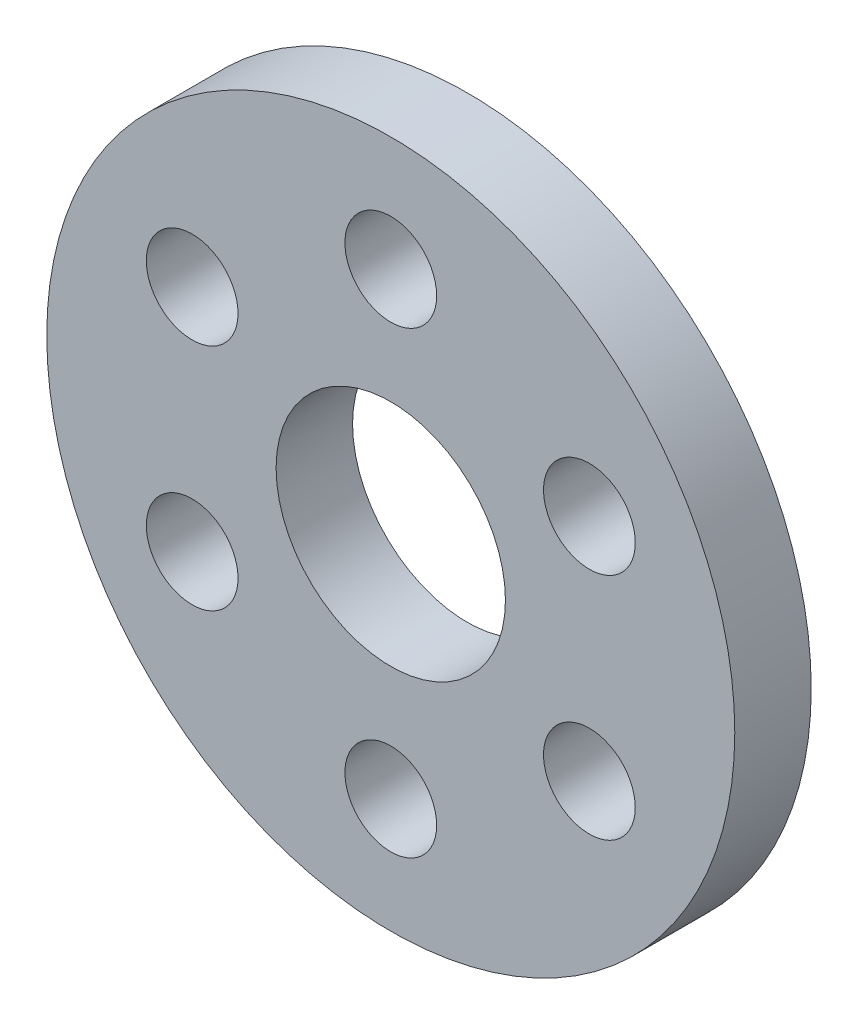
ISO-10303-21;
HEADER;
FILE_DESCRIPTION(('STEP AP214'),'2;1');
FILE_NAME('part.step','',(''),(''),'','','');
FILE_SCHEMA(('AUTOMOTIVE_DESIGN { 1 0 10303 214 1 1 1 1 }'));
ENDSEC;
DATA;
#1=APPLICATION_CONTEXT('core data for automotive mechanical design processes');
#2=APPLICATION_PROTOCOL_DEFINITION('international standard','automotive_design',2000,#1);
#3=PRODUCT_CONTEXT('',#1,'mechanical');
#4=PRODUCT('Part','Part','',(#3));
#5=PRODUCT_RELATED_PRODUCT_CATEGORY('part','',(#4));
#6=PRODUCT_DEFINITION_FORMATION('','',#4);
#7=PRODUCT_DEFINITION_CONTEXT('part definition',#1,'design');
#8=PRODUCT_DEFINITION('design','',#6,#7);
#9=PRODUCT_DEFINITION_SHAPE('','',#8);
#10=(LENGTH_UNIT() NAMED_UNIT(*) SI_UNIT(.MILLI.,.METRE.));
#11=(NAMED_UNIT(*) PLANE_ANGLE_UNIT() SI_UNIT($,.RADIAN.));
#12=(NAMED_UNIT(*) SI_UNIT($,.STERADIAN.) SOLID_ANGLE_UNIT());
#13=UNCERTAINTY_MEASURE_WITH_UNIT(LENGTH_MEASURE(1.E-05),#10,'distance_accuracy_value','');
#14=(GEOMETRIC_REPRESENTATION_CONTEXT(3) GLOBAL_UNCERTAINTY_ASSIGNED_CONTEXT((#13)) GLOBAL_UNIT_ASSIGNED_CONTEXT((#10,
#11,#12)) REPRESENTATION_CONTEXT('',''));
#15=CARTESIAN_POINT('',(0.,0.,0.));
#16=DIRECTION('',(0.,0.,1.));
#17=DIRECTION('',(1.,0.,0.));
#18=AXIS2_PLACEMENT_3D('',#15,#16,#17);
#19=CARTESIAN_POINT('',(0.,0.,15.));
#20=DIRECTION('',(0.,0.,1.));
#21=DIRECTION('',(1.,0.,0.));
#22=AXIS2_PLACEMENT_3D('',#19,#20,#21);
#23=PLANE('',#22);
#24=CARTESIAN_POINT('',(-38.9711431702999,22.4999999999996,15.));
#25=DIRECTION('',(0.,0.,1.));
#26=DIRECTION('',(1.,0.,0.));
#27=AXIS2_PLACEMENT_3D('',#24,#25,#26);
#28=CIRCLE('',#27,9.);
#29=CARTESIAN_POINT('',(-29.9711431702999,22.4999999999996,15.));
#30=VERTEX_POINT('',#29);
#31=EDGE_CURVE('E91',#30,#30,#28,.T.);
#32=ORIENTED_EDGE('',*,*,#31,.F.);
#33=EDGE_LOOP('',(#32));
#34=FACE_BOUND('',#33,.T.);
#35=CARTESIAN_POINT('',(38.9711431702996,22.5000000000002,15.));
#36=DIRECTION('',(0.,0.,1.));
#37=DIRECTION('',(1.,0.,0.));
#38=AXIS2_PLACEMENT_3D('',#35,#36,#37);
#39=CIRCLE('',#38,9.);
#40=CARTESIAN_POINT('',(47.9711431702996,22.5000000000002,15.));
#41=VERTEX_POINT('',#40);
#42=EDGE_CURVE('E75',#41,#41,#39,.T.);
#43=ORIENTED_EDGE('',*,*,#42,.F.);
#44=EDGE_LOOP('',(#43));
#45=FACE_BOUND('',#44,.T.);
#46=CARTESIAN_POINT('',(0.,-45.,15.));
#47=DIRECTION('',(0.,0.,1.));
#48=DIRECTION('',(1.,0.,0.));
#49=AXIS2_PLACEMENT_3D('',#46,#47,#48);
#50=CIRCLE('',#49,9.);
#51=CARTESIAN_POINT('',(9.,-45.,15.));
#52=VERTEX_POINT('',#51);
#53=EDGE_CURVE('E59',#52,#52,#50,.T.);
#54=ORIENTED_EDGE('',*,*,#53,.F.);
#55=EDGE_LOOP('',(#54));
#56=FACE_BOUND('',#55,.T.);
#57=CARTESIAN_POINT('',(0.,0.,15.));
#58=DIRECTION('',(0.,0.,1.));
#59=DIRECTION('',(1.,0.,0.));
#60=AXIS2_PLACEMENT_3D('',#57,#58,#59);
#61=CIRCLE('',#60,67.5);
#62=CARTESIAN_POINT('',(67.5,0.,15.));
#63=VERTEX_POINT('',#62);
#64=EDGE_CURVE('E10',#63,#63,#61,.T.);
#65=ORIENTED_EDGE('',*,*,#64,.T.);
#66=EDGE_LOOP('',(#65));
#67=FACE_BOUND('',#66,.T.);
#68=CARTESIAN_POINT('',(0.,0.,15.));
#69=DIRECTION('',(0.,0.,1.));
#70=DIRECTION('',(1.,0.,0.));
#71=AXIS2_PLACEMENT_3D('',#68,#69,#70);
#72=CIRCLE('',#71,22.5);
#73=CARTESIAN_POINT('',(22.5,0.,15.));
#74=VERTEX_POINT('',#73);
#75=EDGE_CURVE('E53',#74,#74,#72,.T.);
#76=ORIENTED_EDGE('',*,*,#75,.F.);
#77=EDGE_LOOP('',(#76));
#78=FACE_BOUND('',#77,.T.);
#79=CARTESIAN_POINT('',(38.9711431702998,-22.4999999999999,15.));
#80=DIRECTION('',(0.,0.,1.));
#81=DIRECTION('',(1.,0.,0.));
#82=AXIS2_PLACEMENT_3D('',#79,#80,#81);
#83=CIRCLE('',#82,9.);
#84=CARTESIAN_POINT('',(47.9711431702998,-22.4999999999999,15.));
#85=VERTEX_POINT('',#84);
#86=EDGE_CURVE('E67',#85,#85,#83,.T.);
#87=ORIENTED_EDGE('',*,*,#86,.F.);
#88=EDGE_LOOP('',(#87));
#89=FACE_BOUND('',#88,.T.);
#90=CARTESIAN_POINT('',(-3.14233320495882E-13,45.,15.));
#91=DIRECTION('',(0.,0.,1.));
#92=DIRECTION('',(1.,0.,0.));
#93=AXIS2_PLACEMENT_3D('',#90,#91,#92);
#94=CIRCLE('',#93,9.);
#95=CARTESIAN_POINT('',(8.99999999999969,45.,15.));
#96=VERTEX_POINT('',#95);
#97=EDGE_CURVE('E83',#96,#96,#94,.T.);
#98=ORIENTED_EDGE('',*,*,#97,.F.);
#99=EDGE_LOOP('',(#98));
#100=FACE_BOUND('',#99,.T.);
#101=CARTESIAN_POINT('',(-38.9711431702995,-22.5000000000005,15.));
#102=DIRECTION('',(0.,0.,1.));
#103=DIRECTION('',(1.,0.,0.));
#104=AXIS2_PLACEMENT_3D('',#101,#102,#103);
#105=CIRCLE('',#104,9.);
#106=CARTESIAN_POINT('',(-29.9711431702995,-22.5000000000005,15.));
#107=VERTEX_POINT('',#106);
#108=EDGE_CURVE('E99',#107,#107,#105,.T.);
#109=ORIENTED_EDGE('',*,*,#108,.F.);
#110=EDGE_LOOP('',(#109));
#111=FACE_BOUND('',#110,.T.);
#112=ADVANCED_FACE('F40',(#34,#45,#56,#67,#78,#89,#100,#111),#23,.T.);
#113=CARTESIAN_POINT('',(0.,0.,0.));
#114=DIRECTION('',(0.,0.,1.));
#115=DIRECTION('',(1.,0.,0.));
#116=AXIS2_PLACEMENT_3D('',#113,#114,#115);
#117=PLANE('',#116);
#118=CARTESIAN_POINT('',(0.,0.,0.));
#119=DIRECTION('',(0.,0.,1.));
#120=DIRECTION('',(1.,0.,0.));
#121=AXIS2_PLACEMENT_3D('',#118,#119,#120);
#122=CIRCLE('',#121,67.5);
#123=CARTESIAN_POINT('',(67.5,0.,0.));
#124=VERTEX_POINT('',#123);
#125=EDGE_CURVE('E44',#124,#124,#122,.T.);
#126=ORIENTED_EDGE('',*,*,#125,.F.);
#127=EDGE_LOOP('',(#126));
#128=FACE_BOUND('',#127,.T.);
#129=CARTESIAN_POINT('',(0.,0.,0.));
#130=DIRECTION('',(0.,0.,1.));
#131=DIRECTION('',(1.,0.,0.));
#132=AXIS2_PLACEMENT_3D('',#129,#130,#131);
#133=CIRCLE('',#132,22.5);
#134=CARTESIAN_POINT('',(22.5,0.,0.));
#135=VERTEX_POINT('',#134);
#136=EDGE_CURVE('E55',#135,#135,#133,.T.);
#137=ORIENTED_EDGE('',*,*,#136,.T.);
#138=EDGE_LOOP('',(#137));
#139=FACE_BOUND('',#138,.T.);
#140=CARTESIAN_POINT('',(0.,-45.,0.));
#141=DIRECTION('',(0.,0.,1.));
#142=DIRECTION('',(1.,0.,0.));
#143=AXIS2_PLACEMENT_3D('',#140,#141,#142);
#144=CIRCLE('',#143,9.);
#145=CARTESIAN_POINT('',(9.,-45.,0.));
#146=VERTEX_POINT('',#145);
#147=EDGE_CURVE('E63',#146,#146,#144,.T.);
#148=ORIENTED_EDGE('',*,*,#147,.T.);
#149=EDGE_LOOP('',(#148));
#150=FACE_BOUND('',#149,.T.);
#151=CARTESIAN_POINT('',(38.9711431702998,-22.4999999999999,0.));
#152=DIRECTION('',(0.,0.,1.));
#153=DIRECTION('',(1.,0.,0.));
#154=AXIS2_PLACEMENT_3D('',#151,#152,#153);
#155=CIRCLE('',#154,9.);
#156=CARTESIAN_POINT('',(47.9711431702998,-22.4999999999999,0.));
#157=VERTEX_POINT('',#156);
#158=EDGE_CURVE('E71',#157,#157,#155,.T.);
#159=ORIENTED_EDGE('',*,*,#158,.T.);
#160=EDGE_LOOP('',(#159));
#161=FACE_BOUND('',#160,.T.);
#162=CARTESIAN_POINT('',(38.9711431702996,22.5000000000002,0.));
#163=DIRECTION('',(0.,0.,1.));
#164=DIRECTION('',(1.,0.,0.));
#165=AXIS2_PLACEMENT_3D('',#162,#163,#164);
#166=CIRCLE('',#165,9.);
#167=CARTESIAN_POINT('',(47.9711431702996,22.5000000000002,0.));
#168=VERTEX_POINT('',#167);
#169=EDGE_CURVE('E79',#168,#168,#166,.T.);
#170=ORIENTED_EDGE('',*,*,#169,.T.);
#171=EDGE_LOOP('',(#170));
#172=FACE_BOUND('',#171,.T.);
#173=CARTESIAN_POINT('',(-3.14233320495882E-13,45.,0.));
#174=DIRECTION('',(0.,0.,1.));
#175=DIRECTION('',(1.,0.,0.));
#176=AXIS2_PLACEMENT_3D('',#173,#174,#175);
#177=CIRCLE('',#176,9.);
#178=CARTESIAN_POINT('',(8.99999999999969,45.,0.));
#179=VERTEX_POINT('',#178);
#180=EDGE_CURVE('E87',#179,#179,#177,.T.);
#181=ORIENTED_EDGE('',*,*,#180,.T.);
#182=EDGE_LOOP('',(#181));
#183=FACE_BOUND('',#182,.T.);
#184=CARTESIAN_POINT('',(-38.9711431702999,22.4999999999996,0.));
#185=DIRECTION('',(0.,0.,1.));
#186=DIRECTION('',(1.,0.,0.));
#187=AXIS2_PLACEMENT_3D('',#184,#185,#186);
#188=CIRCLE('',#187,9.);
#189=CARTESIAN_POINT('',(-29.9711431702999,22.4999999999996,0.));
#190=VERTEX_POINT('',#189);
#191=EDGE_CURVE('E95',#190,#190,#188,.T.);
#192=ORIENTED_EDGE('',*,*,#191,.T.);
#193=EDGE_LOOP('',(#192));
#194=FACE_BOUND('',#193,.T.);
#195=CARTESIAN_POINT('',(-38.9711431702995,-22.5000000000005,0.));
#196=DIRECTION('',(0.,0.,1.));
#197=DIRECTION('',(1.,0.,0.));
#198=AXIS2_PLACEMENT_3D('',#195,#196,#197);
#199=CIRCLE('',#198,9.);
#200=CARTESIAN_POINT('',(-29.9711431702995,-22.5000000000005,0.));
#201=VERTEX_POINT('',#200);
#202=EDGE_CURVE('E103',#201,#201,#199,.T.);
#203=ORIENTED_EDGE('',*,*,#202,.T.);
#204=EDGE_LOOP('',(#203));
#205=FACE_BOUND('',#204,.T.);
#206=ADVANCED_FACE('F115',(#128,#139,#150,#161,#172,#183,#194,#205),#117,.F.);
#207=CARTESIAN_POINT('',(0.,0.,15.));
#208=DIRECTION('',(0.,0.,-1.));
#209=DIRECTION('',(-1.,0.,0.));
#210=AXIS2_PLACEMENT_3D('',#207,#208,#209);
#211=CYLINDRICAL_SURFACE('',#210,67.5);
#212=ORIENTED_EDGE('',*,*,#64,.F.);
#213=EDGE_LOOP('',(#212));
#214=FACE_BOUND('',#213,.T.);
#215=ORIENTED_EDGE('',*,*,#125,.T.);
#216=EDGE_LOOP('',(#215));
#217=FACE_BOUND('',#216,.T.);
#218=ADVANCED_FACE('F42',(#214,#217),#211,.T.);
#219=CARTESIAN_POINT('',(0.,0.,15.));
#220=DIRECTION('',(0.,0.,-1.));
#221=DIRECTION('',(-1.,0.,0.));
#222=AXIS2_PLACEMENT_3D('',#219,#220,#221);
#223=CYLINDRICAL_SURFACE('',#222,22.5);
#224=ORIENTED_EDGE('',*,*,#75,.T.);
#225=EDGE_LOOP('',(#224));
#226=FACE_BOUND('',#225,.T.);
#227=ORIENTED_EDGE('',*,*,#136,.F.);
#228=EDGE_LOOP('',(#227));
#229=FACE_BOUND('',#228,.T.);
#230=ADVANCED_FACE('F125',(#226,#229),#223,.F.);
#231=CARTESIAN_POINT('',(0.,-45.,15.));
#232=DIRECTION('',(0.,0.,-1.));
#233=DIRECTION('',(-1.,0.,0.));
#234=AXIS2_PLACEMENT_3D('',#231,#232,#233);
#235=CYLINDRICAL_SURFACE('',#234,9.);
#236=ORIENTED_EDGE('',*,*,#53,.T.);
#237=EDGE_LOOP('',(#236));
#238=FACE_BOUND('',#237,.T.);
#239=ORIENTED_EDGE('',*,*,#147,.F.);
#240=EDGE_LOOP('',(#239));
#241=FACE_BOUND('',#240,.T.);
#242=ADVANCED_FACE('F128',(#238,#241),#235,.F.);
#243=CARTESIAN_POINT('',(38.9711431702998,-22.4999999999999,15.));
#244=DIRECTION('',(0.,0.,-1.));
#245=DIRECTION('',(-1.,0.,0.));
#246=AXIS2_PLACEMENT_3D('',#243,#244,#245);
#247=CYLINDRICAL_SURFACE('',#246,9.);
#248=ORIENTED_EDGE('',*,*,#86,.T.);
#249=EDGE_LOOP('',(#248));
#250=FACE_BOUND('',#249,.T.);
#251=ORIENTED_EDGE('',*,*,#158,.F.);
#252=EDGE_LOOP('',(#251));
#253=FACE_BOUND('',#252,.T.);
#254=ADVANCED_FACE('F132',(#250,#253),#247,.F.);
#255=CARTESIAN_POINT('',(38.9711431702996,22.5000000000002,15.));
#256=DIRECTION('',(0.,0.,-1.));
#257=DIRECTION('',(-1.,0.,0.));
#258=AXIS2_PLACEMENT_3D('',#255,#256,#257);
#259=CYLINDRICAL_SURFACE('',#258,9.);
#260=ORIENTED_EDGE('',*,*,#42,.T.);
#261=EDGE_LOOP('',(#260));
#262=FACE_BOUND('',#261,.T.);
#263=ORIENTED_EDGE('',*,*,#169,.F.);
#264=EDGE_LOOP('',(#263));
#265=FACE_BOUND('',#264,.T.);
#266=ADVANCED_FACE('F136',(#262,#265),#259,.F.);
#267=CARTESIAN_POINT('',(-3.14233320495882E-13,45.,15.));
#268=DIRECTION('',(0.,0.,-1.));
#269=DIRECTION('',(-1.,0.,0.));
#270=AXIS2_PLACEMENT_3D('',#267,#268,#269);
#271=CYLINDRICAL_SURFACE('',#270,9.);
#272=ORIENTED_EDGE('',*,*,#97,.T.);
#273=EDGE_LOOP('',(#272));
#274=FACE_BOUND('',#273,.T.);
#275=ORIENTED_EDGE('',*,*,#180,.F.);
#276=EDGE_LOOP('',(#275));
#277=FACE_BOUND('',#276,.T.);
#278=ADVANCED_FACE('F140',(#274,#277),#271,.F.);
#279=CARTESIAN_POINT('',(-38.9711431702999,22.4999999999996,15.));
#280=DIRECTION('',(0.,0.,-1.));
#281=DIRECTION('',(-1.,0.,0.));
#282=AXIS2_PLACEMENT_3D('',#279,#280,#281);
#283=CYLINDRICAL_SURFACE('',#282,9.);
#284=ORIENTED_EDGE('',*,*,#31,.T.);
#285=EDGE_LOOP('',(#284));
#286=FACE_BOUND('',#285,.T.);
#287=ORIENTED_EDGE('',*,*,#191,.F.);
#288=EDGE_LOOP('',(#287));
#289=FACE_BOUND('',#288,.T.);
#290=ADVANCED_FACE('F144',(#286,#289),#283,.F.);
#291=CARTESIAN_POINT('',(-38.9711431702995,-22.5000000000005,15.));
#292=DIRECTION('',(0.,0.,-1.));
#293=DIRECTION('',(-1.,0.,0.));
#294=AXIS2_PLACEMENT_3D('',#291,#292,#293);
#295=CYLINDRICAL_SURFACE('',#294,9.);
#296=ORIENTED_EDGE('',*,*,#108,.T.);
#297=EDGE_LOOP('',(#296));
#298=FACE_BOUND('',#297,.T.);
#299=ORIENTED_EDGE('',*,*,#202,.F.);
#300=EDGE_LOOP('',(#299));
#301=FACE_BOUND('',#300,.T.);
#302=ADVANCED_FACE('F111',(#298,#301),#295,.F.);
#303=CLOSED_SHELL('',(#112,#206,#218,#230,#242,#254,#266,#278,#290,#302));
#304=MANIFOLD_SOLID_BREP('B2',#303);
#305=ADVANCED_BREP_SHAPE_REPRESENTATION('',(#18,#304),#14);
#306=SHAPE_DEFINITION_REPRESENTATION(#9,#305);
ENDSEC;
END-ISO-10303-21;
